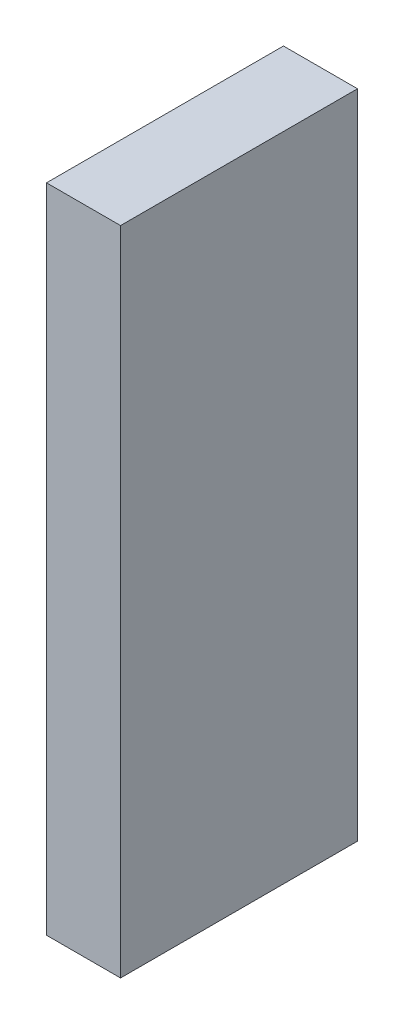
ISO-10303-21;
HEADER;
FILE_DESCRIPTION(('STEP AP214'),'2;1');
FILE_NAME('part.step','',(''),(''),'','','');
FILE_SCHEMA(('AUTOMOTIVE_DESIGN { 1 0 10303 214 1 1 1 1 }'));
ENDSEC;
DATA;
#1=APPLICATION_CONTEXT('core data for automotive mechanical design processes');
#2=APPLICATION_PROTOCOL_DEFINITION('international standard','automotive_design',2000,#1);
#3=PRODUCT_CONTEXT('',#1,'mechanical');
#4=PRODUCT('Part','Part','',(#3));
#5=PRODUCT_RELATED_PRODUCT_CATEGORY('part','',(#4));
#6=PRODUCT_DEFINITION_FORMATION('','',#4);
#7=PRODUCT_DEFINITION_CONTEXT('part definition',#1,'design');
#8=PRODUCT_DEFINITION('design','',#6,#7);
#9=PRODUCT_DEFINITION_SHAPE('','',#8);
#10=(LENGTH_UNIT() NAMED_UNIT(*) SI_UNIT(.MILLI.,.METRE.));
#11=(NAMED_UNIT(*) PLANE_ANGLE_UNIT() SI_UNIT($,.RADIAN.));
#12=(NAMED_UNIT(*) SI_UNIT($,.STERADIAN.) SOLID_ANGLE_UNIT());
#13=UNCERTAINTY_MEASURE_WITH_UNIT(LENGTH_MEASURE(1.E-05),#10,'distance_accuracy_value','');
#14=(GEOMETRIC_REPRESENTATION_CONTEXT(3) GLOBAL_UNCERTAINTY_ASSIGNED_CONTEXT((#13)) GLOBAL_UNIT_ASSIGNED_CONTEXT((#10,
#11,#12)) REPRESENTATION_CONTEXT('',''));
#15=CARTESIAN_POINT('',(0.,0.,0.));
#16=DIRECTION('',(0.,0.,1.));
#17=DIRECTION('',(1.,0.,0.));
#18=AXIS2_PLACEMENT_3D('',#15,#16,#17);
#19=CARTESIAN_POINT('',(47.5,400.,-600.));
#20=DIRECTION('',(-1.,0.,0.));
#21=DIRECTION('',(0.,0.,1.));
#22=AXIS2_PLACEMENT_3D('',#19,#20,#21);
#23=PLANE('',#22);
#24=DIRECTION('',(0.,-1.,0.));
#25=VECTOR('',#24,1.);
#26=CARTESIAN_POINT('',(47.5,400.,-200.));
#27=LINE('',#26,#25);
#28=CARTESIAN_POINT('',(47.5,1500.,-200.));
#29=VERTEX_POINT('',#28);
#30=CARTESIAN_POINT('',(47.5,400.,-200.));
#31=VERTEX_POINT('',#30);
#32=EDGE_CURVE('E103',#29,#31,#27,.T.);
#33=ORIENTED_EDGE('',*,*,#32,.F.);
#34=DIRECTION('',(0.,0.,1.));
#35=VECTOR('',#34,1.);
#36=CARTESIAN_POINT('',(47.5,1500.,-600.));
#37=LINE('',#36,#35);
#38=CARTESIAN_POINT('',(47.5,1500.,-600.));
#39=VERTEX_POINT('',#38);
#40=EDGE_CURVE('E11',#39,#29,#37,.T.);
#41=ORIENTED_EDGE('',*,*,#40,.F.);
#42=DIRECTION('',(0.,-1.,0.));
#43=VECTOR('',#42,1.);
#44=CARTESIAN_POINT('',(47.5,400.,-600.));
#45=LINE('',#44,#43);
#46=CARTESIAN_POINT('',(47.5,400.,-600.));
#47=VERTEX_POINT('',#46);
#48=EDGE_CURVE('E97',#39,#47,#45,.T.);
#49=ORIENTED_EDGE('',*,*,#48,.T.);
#50=DIRECTION('',(0.,0.,1.));
#51=VECTOR('',#50,1.);
#52=CARTESIAN_POINT('',(47.5,400.,-600.));
#53=LINE('',#52,#51);
#54=EDGE_CURVE('E42',#47,#31,#53,.T.);
#55=ORIENTED_EDGE('',*,*,#54,.T.);
#56=EDGE_LOOP('',(#33,#41,#49,#55));
#57=FACE_BOUND('',#56,.T.);
#58=ADVANCED_FACE('F39',(#57),#23,.T.);
#59=CARTESIAN_POINT('',(47.5,1500.,-600.));
#60=DIRECTION('',(0.,1.,0.));
#61=DIRECTION('',(0.,0.,1.));
#62=AXIS2_PLACEMENT_3D('',#59,#60,#61);
#63=PLANE('',#62);
#64=DIRECTION('',(-1.,0.,0.));
#65=VECTOR('',#64,1.);
#66=CARTESIAN_POINT('',(47.5,1500.,-200.));
#67=LINE('',#66,#65);
#68=CARTESIAN_POINT('',(172.5,1500.,-200.));
#69=VERTEX_POINT('',#68);
#70=EDGE_CURVE('E99',#69,#29,#67,.T.);
#71=ORIENTED_EDGE('',*,*,#70,.F.);
#72=DIRECTION('',(0.,0.,1.));
#73=VECTOR('',#72,1.);
#74=CARTESIAN_POINT('',(172.5,1500.,-600.));
#75=LINE('',#74,#73);
#76=CARTESIAN_POINT('',(172.5,1500.,-600.));
#77=VERTEX_POINT('',#76);
#78=EDGE_CURVE('E48',#77,#69,#75,.T.);
#79=ORIENTED_EDGE('',*,*,#78,.F.);
#80=DIRECTION('',(-1.,0.,0.));
#81=VECTOR('',#80,1.);
#82=CARTESIAN_POINT('',(47.5,1500.,-600.));
#83=LINE('',#82,#81);
#84=EDGE_CURVE('E94',#77,#39,#83,.T.);
#85=ORIENTED_EDGE('',*,*,#84,.T.);
#86=ORIENTED_EDGE('',*,*,#40,.T.);
#87=EDGE_LOOP('',(#71,#79,#85,#86));
#88=FACE_BOUND('',#87,.T.);
#89=ADVANCED_FACE('F113',(#88),#63,.T.);
#90=CARTESIAN_POINT('',(172.5,400.,-600.));
#91=DIRECTION('',(1.,0.,0.));
#92=DIRECTION('',(0.,0.,-1.));
#93=AXIS2_PLACEMENT_3D('',#90,#91,#92);
#94=PLANE('',#93);
#95=DIRECTION('',(0.,1.,0.));
#96=VECTOR('',#95,1.);
#97=CARTESIAN_POINT('',(172.5,400.,-200.));
#98=LINE('',#97,#96);
#99=CARTESIAN_POINT('',(172.5,400.,-200.));
#100=VERTEX_POINT('',#99);
#101=EDGE_CURVE('E89',#100,#69,#98,.T.);
#102=ORIENTED_EDGE('',*,*,#101,.F.);
#103=DIRECTION('',(0.,0.,1.));
#104=VECTOR('',#103,1.);
#105=CARTESIAN_POINT('',(172.5,400.,-600.));
#106=LINE('',#105,#104);
#107=CARTESIAN_POINT('',(172.5,400.,-600.));
#108=VERTEX_POINT('',#107);
#109=EDGE_CURVE('E84',#108,#100,#106,.T.);
#110=ORIENTED_EDGE('',*,*,#109,.F.);
#111=DIRECTION('',(0.,1.,0.));
#112=VECTOR('',#111,1.);
#113=CARTESIAN_POINT('',(172.5,400.,-600.));
#114=LINE('',#113,#112);
#115=EDGE_CURVE('E87',#108,#77,#114,.T.);
#116=ORIENTED_EDGE('',*,*,#115,.T.);
#117=ORIENTED_EDGE('',*,*,#78,.T.);
#118=EDGE_LOOP('',(#102,#110,#116,#117));
#119=FACE_BOUND('',#118,.T.);
#120=ADVANCED_FACE('F86',(#119),#94,.T.);
#121=CARTESIAN_POINT('',(47.5,400.,-600.));
#122=DIRECTION('',(0.,-1.,0.));
#123=DIRECTION('',(0.,0.,-1.));
#124=AXIS2_PLACEMENT_3D('',#121,#122,#123);
#125=PLANE('',#124);
#126=DIRECTION('',(1.,0.,0.));
#127=VECTOR('',#126,1.);
#128=CARTESIAN_POINT('',(47.5,400.,-200.));
#129=LINE('',#128,#127);
#130=EDGE_CURVE('E106',#31,#100,#129,.T.);
#131=ORIENTED_EDGE('',*,*,#130,.F.);
#132=ORIENTED_EDGE('',*,*,#54,.F.);
#133=DIRECTION('',(1.,0.,0.));
#134=VECTOR('',#133,1.);
#135=CARTESIAN_POINT('',(47.5,400.,-600.));
#136=LINE('',#135,#134);
#137=EDGE_CURVE('E93',#47,#108,#136,.T.);
#138=ORIENTED_EDGE('',*,*,#137,.T.);
#139=ORIENTED_EDGE('',*,*,#109,.T.);
#140=EDGE_LOOP('',(#131,#132,#138,#139));
#141=FACE_BOUND('',#140,.T.);
#142=ADVANCED_FACE('F96',(#141),#125,.T.);
#143=CARTESIAN_POINT('',(0.,0.,-600.));
#144=DIRECTION('',(0.,0.,-1.));
#145=DIRECTION('',(-1.,0.,0.));
#146=AXIS2_PLACEMENT_3D('',#143,#144,#145);
#147=PLANE('',#146);
#148=ORIENTED_EDGE('',*,*,#48,.F.);
#149=ORIENTED_EDGE('',*,*,#84,.F.);
#150=ORIENTED_EDGE('',*,*,#115,.F.);
#151=ORIENTED_EDGE('',*,*,#137,.F.);
#152=EDGE_LOOP('',(#148,#149,#150,#151));
#153=FACE_BOUND('',#152,.T.);
#154=ADVANCED_FACE('F92',(#153),#147,.T.);
#155=CARTESIAN_POINT('',(0.,0.,-200.));
#156=DIRECTION('',(0.,0.,-1.));
#157=DIRECTION('',(-1.,0.,0.));
#158=AXIS2_PLACEMENT_3D('',#155,#156,#157);
#159=PLANE('',#158);
#160=ORIENTED_EDGE('',*,*,#32,.T.);
#161=ORIENTED_EDGE('',*,*,#130,.T.);
#162=ORIENTED_EDGE('',*,*,#101,.T.);
#163=ORIENTED_EDGE('',*,*,#70,.T.);
#164=EDGE_LOOP('',(#160,#161,#162,#163));
#165=FACE_BOUND('',#164,.T.);
#166=ADVANCED_FACE('F112',(#165),#159,.F.);
#167=CLOSED_SHELL('',(#58,#89,#120,#142,#154,#166));
#168=MANIFOLD_SOLID_BREP('B2',#167);
#169=ADVANCED_BREP_SHAPE_REPRESENTATION('',(#18,#168),#14);
#170=SHAPE_DEFINITION_REPRESENTATION(#9,#169);
ENDSEC;
END-ISO-10303-21;
